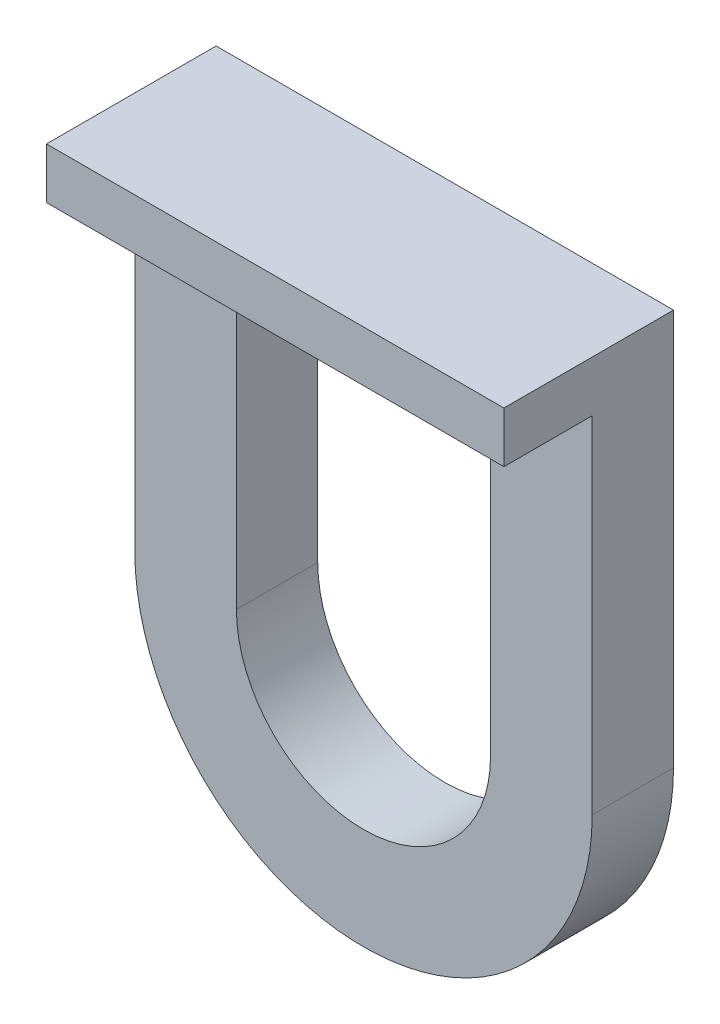
ISO-10303-21;
HEADER;
FILE_DESCRIPTION(('STEP AP214'),'2;1');
FILE_NAME('part.step','',(''),(''),'','','');
FILE_SCHEMA(('AUTOMOTIVE_DESIGN { 1 0 10303 214 1 1 1 1 }'));
ENDSEC;
DATA;
#1=APPLICATION_CONTEXT('core data for automotive mechanical design processes');
#2=APPLICATION_PROTOCOL_DEFINITION('international standard','automotive_design',2000,#1);
#3=PRODUCT_CONTEXT('',#1,'mechanical');
#4=PRODUCT('Part','Part','',(#3));
#5=PRODUCT_RELATED_PRODUCT_CATEGORY('part','',(#4));
#6=PRODUCT_DEFINITION_FORMATION('','',#4);
#7=PRODUCT_DEFINITION_CONTEXT('part definition',#1,'design');
#8=PRODUCT_DEFINITION('design','',#6,#7);
#9=PRODUCT_DEFINITION_SHAPE('','',#8);
#10=(LENGTH_UNIT() NAMED_UNIT(*) SI_UNIT(.MILLI.,.METRE.));
#11=(NAMED_UNIT(*) PLANE_ANGLE_UNIT() SI_UNIT($,.RADIAN.));
#12=(NAMED_UNIT(*) SI_UNIT($,.STERADIAN.) SOLID_ANGLE_UNIT());
#13=UNCERTAINTY_MEASURE_WITH_UNIT(LENGTH_MEASURE(1.E-05),#10,'distance_accuracy_value','');
#14=(GEOMETRIC_REPRESENTATION_CONTEXT(3) GLOBAL_UNCERTAINTY_ASSIGNED_CONTEXT((#13)) GLOBAL_UNIT_ASSIGNED_CONTEXT((#10,
#11,#12)) REPRESENTATION_CONTEXT('',''));
#15=CARTESIAN_POINT('',(0.,0.,0.));
#16=DIRECTION('',(0.,0.,1.));
#17=DIRECTION('',(1.,0.,0.));
#18=AXIS2_PLACEMENT_3D('',#15,#16,#17);
#19=CARTESIAN_POINT('',(-12.5,0.,8.));
#20=DIRECTION('',(-1.,0.,0.));
#21=DIRECTION('',(0.,0.,1.));
#22=AXIS2_PLACEMENT_3D('',#19,#20,#21);
#23=PLANE('',#22);
#24=DIRECTION('',(0.,0.,1.));
#25=VECTOR('',#24,1.);
#26=CARTESIAN_POINT('',(-12.5,34.,-25.4950975679639));
#27=LINE('',#26,#25);
#28=CARTESIAN_POINT('',(-12.5,34.,0.));
#29=VERTEX_POINT('',#28);
#30=CARTESIAN_POINT('',(-12.5,34.,8.));
#31=VERTEX_POINT('',#30);
#32=EDGE_CURVE('E116',#29,#31,#27,.T.);
#33=ORIENTED_EDGE('',*,*,#32,.T.);
#34=DIRECTION('',(0.,1.,0.));
#35=VECTOR('',#34,1.);
#36=CARTESIAN_POINT('',(-12.5,0.,8.));
#37=LINE('',#36,#35);
#38=CARTESIAN_POINT('',(-12.5,0.,8.));
#39=VERTEX_POINT('',#38);
#40=EDGE_CURVE('E122',#39,#31,#37,.T.);
#41=ORIENTED_EDGE('',*,*,#40,.F.);
#42=DIRECTION('',(0.,0.,-1.));
#43=VECTOR('',#42,1.);
#44=CARTESIAN_POINT('',(-12.5,0.,8.));
#45=LINE('',#44,#43);
#46=CARTESIAN_POINT('',(-12.5,0.,0.));
#47=VERTEX_POINT('',#46);
#48=EDGE_CURVE('E11',#39,#47,#45,.T.);
#49=ORIENTED_EDGE('',*,*,#48,.T.);
#50=DIRECTION('',(0.,1.,0.));
#51=VECTOR('',#50,1.);
#52=CARTESIAN_POINT('',(-12.5,0.,0.));
#53=LINE('',#52,#51);
#54=EDGE_CURVE('E47',#47,#29,#53,.T.);
#55=ORIENTED_EDGE('',*,*,#54,.T.);
#56=EDGE_LOOP('',(#33,#41,#49,#55));
#57=FACE_BOUND('',#56,.T.);
#58=ADVANCED_FACE('F33',(#57),#23,.F.);
#59=CARTESIAN_POINT('',(12.5,0.,8.));
#60=DIRECTION('',(1.,0.,0.));
#61=DIRECTION('',(0.,0.,-1.));
#62=AXIS2_PLACEMENT_3D('',#59,#60,#61);
#63=PLANE('',#62);
#64=DIRECTION('',(0.,0.,1.));
#65=VECTOR('',#64,1.);
#66=CARTESIAN_POINT('',(12.5,34.,-25.4950975679639));
#67=LINE('',#66,#65);
#68=CARTESIAN_POINT('',(12.5,34.,0.));
#69=VERTEX_POINT('',#68);
#70=CARTESIAN_POINT('',(12.5,34.,8.));
#71=VERTEX_POINT('',#70);
#72=EDGE_CURVE('E55',#69,#71,#67,.T.);
#73=ORIENTED_EDGE('',*,*,#72,.F.);
#74=DIRECTION('',(0.,-1.,0.));
#75=VECTOR('',#74,1.);
#76=CARTESIAN_POINT('',(12.5,0.,0.));
#77=LINE('',#76,#75);
#78=CARTESIAN_POINT('',(12.5,0.,0.));
#79=VERTEX_POINT('',#78);
#80=EDGE_CURVE('E158',#69,#79,#77,.T.);
#81=ORIENTED_EDGE('',*,*,#80,.T.);
#82=DIRECTION('',(0.,0.,-1.));
#83=VECTOR('',#82,1.);
#84=CARTESIAN_POINT('',(12.5,0.,8.));
#85=LINE('',#84,#83);
#86=CARTESIAN_POINT('',(12.5,0.,8.));
#87=VERTEX_POINT('',#86);
#88=EDGE_CURVE('E169',#87,#79,#85,.T.);
#89=ORIENTED_EDGE('',*,*,#88,.F.);
#90=DIRECTION('',(0.,-1.,0.));
#91=VECTOR('',#90,1.);
#92=CARTESIAN_POINT('',(12.5,0.,8.));
#93=LINE('',#92,#91);
#94=EDGE_CURVE('E167',#71,#87,#93,.T.);
#95=ORIENTED_EDGE('',*,*,#94,.F.);
#96=EDGE_LOOP('',(#73,#81,#89,#95));
#97=FACE_BOUND('',#96,.T.);
#98=ADVANCED_FACE('F210',(#97),#63,.F.);
#99=CARTESIAN_POINT('',(0.,0.,8.));
#100=DIRECTION('',(0.,0.,-1.));
#101=DIRECTION('',(-1.,0.,0.));
#102=AXIS2_PLACEMENT_3D('',#99,#100,#101);
#103=CYLINDRICAL_SURFACE('',#102,12.5);
#104=CARTESIAN_POINT('',(0.,0.,0.));
#105=DIRECTION('',(0.,0.,-1.));
#106=DIRECTION('',(1.,0.,0.));
#107=AXIS2_PLACEMENT_3D('',#104,#105,#106);
#108=CIRCLE('',#107,12.5);
#109=EDGE_CURVE('E157',#79,#47,#108,.T.);
#110=ORIENTED_EDGE('',*,*,#109,.T.);
#111=ORIENTED_EDGE('',*,*,#48,.F.);
#112=CARTESIAN_POINT('',(0.,0.,8.));
#113=DIRECTION('',(0.,0.,-1.));
#114=DIRECTION('',(1.,0.,0.));
#115=AXIS2_PLACEMENT_3D('',#112,#113,#114);
#116=CIRCLE('',#115,12.5);
#117=EDGE_CURVE('E127',#87,#39,#116,.T.);
#118=ORIENTED_EDGE('',*,*,#117,.F.);
#119=ORIENTED_EDGE('',*,*,#88,.T.);
#120=EDGE_LOOP('',(#110,#111,#118,#119));
#121=FACE_BOUND('',#120,.T.);
#122=ADVANCED_FACE('F35',(#121),#103,.F.);
#123=CARTESIAN_POINT('',(-22.5,34.,8.));
#124=DIRECTION('',(1.,0.,0.));
#125=DIRECTION('',(0.,0.,-1.));
#126=AXIS2_PLACEMENT_3D('',#123,#124,#125);
#127=PLANE('',#126);
#128=DIRECTION('',(0.,-1.,0.));
#129=VECTOR('',#128,1.);
#130=CARTESIAN_POINT('',(-22.5,34.,0.));
#131=LINE('',#130,#129);
#132=CARTESIAN_POINT('',(-22.5,39.,0.));
#133=VERTEX_POINT('',#132);
#134=CARTESIAN_POINT('',(-22.5,0.,0.));
#135=VERTEX_POINT('',#134);
#136=EDGE_CURVE('E173',#133,#135,#131,.T.);
#137=ORIENTED_EDGE('',*,*,#136,.T.);
#138=DIRECTION('',(0.,0.,-1.));
#139=VECTOR('',#138,1.);
#140=CARTESIAN_POINT('',(-22.5,0.,8.));
#141=LINE('',#140,#139);
#142=CARTESIAN_POINT('',(-22.5,0.,8.));
#143=VERTEX_POINT('',#142);
#144=EDGE_CURVE('E41',#143,#135,#141,.T.);
#145=ORIENTED_EDGE('',*,*,#144,.F.);
#146=DIRECTION('',(0.,-1.,0.));
#147=VECTOR('',#146,1.);
#148=CARTESIAN_POINT('',(-22.5,34.,8.));
#149=LINE('',#148,#147);
#150=CARTESIAN_POINT('',(-22.5,34.,8.));
#151=VERTEX_POINT('',#150);
#152=EDGE_CURVE('E121',#151,#143,#149,.T.);
#153=ORIENTED_EDGE('',*,*,#152,.F.);
#154=DIRECTION('',(0.,0.,1.));
#155=VECTOR('',#154,1.);
#156=CARTESIAN_POINT('',(-22.5,34.,8.68404238410903));
#157=LINE('',#156,#155);
#158=CARTESIAN_POINT('',(-22.5,34.,16.684042384109));
#159=VERTEX_POINT('',#158);
#160=EDGE_CURVE('E118',#151,#159,#157,.T.);
#161=ORIENTED_EDGE('',*,*,#160,.T.);
#162=DIRECTION('',(0.,-1.,0.));
#163=VECTOR('',#162,1.);
#164=CARTESIAN_POINT('',(-22.5,39.,16.684042384109));
#165=LINE('',#164,#163);
#166=CARTESIAN_POINT('',(-22.5,39.,16.684042384109));
#167=VERTEX_POINT('',#166);
#168=EDGE_CURVE('E154',#167,#159,#165,.T.);
#169=ORIENTED_EDGE('',*,*,#168,.F.);
#170=DIRECTION('',(0.,0.,1.));
#171=VECTOR('',#170,1.);
#172=CARTESIAN_POINT('',(-22.5,39.,0.));
#173=LINE('',#172,#171);
#174=EDGE_CURVE('E138',#133,#167,#173,.T.);
#175=ORIENTED_EDGE('',*,*,#174,.F.);
#176=EDGE_LOOP('',(#137,#145,#153,#161,#169,#175));
#177=FACE_BOUND('',#176,.T.);
#178=ADVANCED_FACE('F228',(#177),#127,.F.);
#179=CARTESIAN_POINT('',(0.,0.,8.));
#180=DIRECTION('',(0.,0.,-1.));
#181=DIRECTION('',(-1.,0.,0.));
#182=AXIS2_PLACEMENT_3D('',#179,#180,#181);
#183=CYLINDRICAL_SURFACE('',#182,22.5);
#184=CARTESIAN_POINT('',(0.,0.,0.));
#185=DIRECTION('',(0.,0.,1.));
#186=DIRECTION('',(1.,0.,0.));
#187=AXIS2_PLACEMENT_3D('',#184,#185,#186);
#188=CIRCLE('',#187,22.5);
#189=CARTESIAN_POINT('',(22.5,0.,0.));
#190=VERTEX_POINT('',#189);
#191=EDGE_CURVE('E175',#135,#190,#188,.T.);
#192=ORIENTED_EDGE('',*,*,#191,.T.);
#193=DIRECTION('',(0.,0.,-1.));
#194=VECTOR('',#193,1.);
#195=CARTESIAN_POINT('',(22.5,0.,8.));
#196=LINE('',#195,#194);
#197=CARTESIAN_POINT('',(22.5,0.,8.));
#198=VERTEX_POINT('',#197);
#199=EDGE_CURVE('E183',#198,#190,#196,.T.);
#200=ORIENTED_EDGE('',*,*,#199,.F.);
#201=CARTESIAN_POINT('',(0.,0.,8.));
#202=DIRECTION('',(0.,0.,1.));
#203=DIRECTION('',(1.,0.,0.));
#204=AXIS2_PLACEMENT_3D('',#201,#202,#203);
#205=CIRCLE('',#204,22.5);
#206=EDGE_CURVE('E161',#143,#198,#205,.T.);
#207=ORIENTED_EDGE('',*,*,#206,.F.);
#208=ORIENTED_EDGE('',*,*,#144,.T.);
#209=EDGE_LOOP('',(#192,#200,#207,#208));
#210=FACE_BOUND('',#209,.T.);
#211=ADVANCED_FACE('F190',(#210),#183,.T.);
#212=CARTESIAN_POINT('',(22.5,34.,8.));
#213=DIRECTION('',(-1.,0.,0.));
#214=DIRECTION('',(0.,0.,1.));
#215=AXIS2_PLACEMENT_3D('',#212,#213,#214);
#216=PLANE('',#215);
#217=DIRECTION('',(0.,1.,0.));
#218=VECTOR('',#217,1.);
#219=CARTESIAN_POINT('',(22.5,34.,0.));
#220=LINE('',#219,#218);
#221=CARTESIAN_POINT('',(22.5,39.,0.));
#222=VERTEX_POINT('',#221);
#223=EDGE_CURVE('E177',#190,#222,#220,.T.);
#224=ORIENTED_EDGE('',*,*,#223,.T.);
#225=DIRECTION('',(0.,0.,-1.));
#226=VECTOR('',#225,1.);
#227=CARTESIAN_POINT('',(22.5,39.,16.684042384109));
#228=LINE('',#227,#226);
#229=CARTESIAN_POINT('',(22.5,39.,16.684042384109));
#230=VERTEX_POINT('',#229);
#231=EDGE_CURVE('E143',#230,#222,#228,.T.);
#232=ORIENTED_EDGE('',*,*,#231,.F.);
#233=DIRECTION('',(0.,-1.,0.));
#234=VECTOR('',#233,1.);
#235=CARTESIAN_POINT('',(22.5,39.,16.684042384109));
#236=LINE('',#235,#234);
#237=CARTESIAN_POINT('',(22.5,34.,16.684042384109));
#238=VERTEX_POINT('',#237);
#239=EDGE_CURVE('E146',#230,#238,#236,.T.);
#240=ORIENTED_EDGE('',*,*,#239,.T.);
#241=DIRECTION('',(0.,0.,-1.));
#242=VECTOR('',#241,1.);
#243=CARTESIAN_POINT('',(22.5,34.,16.684042384109));
#244=LINE('',#243,#242);
#245=CARTESIAN_POINT('',(22.5,34.,8.));
#246=VERTEX_POINT('',#245);
#247=EDGE_CURVE('E139',#238,#246,#244,.T.);
#248=ORIENTED_EDGE('',*,*,#247,.T.);
#249=DIRECTION('',(0.,1.,0.));
#250=VECTOR('',#249,1.);
#251=CARTESIAN_POINT('',(22.5,34.,8.));
#252=LINE('',#251,#250);
#253=EDGE_CURVE('E163',#198,#246,#252,.T.);
#254=ORIENTED_EDGE('',*,*,#253,.F.);
#255=ORIENTED_EDGE('',*,*,#199,.T.);
#256=EDGE_LOOP('',(#224,#232,#240,#248,#254,#255));
#257=FACE_BOUND('',#256,.T.);
#258=ADVANCED_FACE('F199',(#257),#216,.F.);
#259=CARTESIAN_POINT('',(0.,0.,8.));
#260=DIRECTION('',(0.,0.,1.));
#261=DIRECTION('',(1.,0.,0.));
#262=AXIS2_PLACEMENT_3D('',#259,#260,#261);
#263=PLANE('',#262);
#264=ORIENTED_EDGE('',*,*,#117,.T.);
#265=ORIENTED_EDGE('',*,*,#40,.T.);
#266=DIRECTION('',(-1.,0.,0.));
#267=VECTOR('',#266,1.);
#268=CARTESIAN_POINT('',(-12.5,34.,8.));
#269=LINE('',#268,#267);
#270=EDGE_CURVE('E111',#31,#151,#269,.T.);
#271=ORIENTED_EDGE('',*,*,#270,.T.);
#272=ORIENTED_EDGE('',*,*,#152,.T.);
#273=ORIENTED_EDGE('',*,*,#206,.T.);
#274=ORIENTED_EDGE('',*,*,#253,.T.);
#275=DIRECTION('',(-1.,0.,0.));
#276=VECTOR('',#275,1.);
#277=CARTESIAN_POINT('',(12.5,34.,8.));
#278=LINE('',#277,#276);
#279=EDGE_CURVE('E165',#246,#71,#278,.T.);
#280=ORIENTED_EDGE('',*,*,#279,.T.);
#281=ORIENTED_EDGE('',*,*,#94,.T.);
#282=EDGE_LOOP('',(#264,#265,#271,#272,#273,#274,#280,#281));
#283=FACE_BOUND('',#282,.T.);
#284=ADVANCED_FACE('F125',(#283),#263,.T.);
#285=CARTESIAN_POINT('',(0.,0.,0.));
#286=DIRECTION('',(0.,0.,1.));
#287=DIRECTION('',(1.,0.,0.));
#288=AXIS2_PLACEMENT_3D('',#285,#286,#287);
#289=PLANE('',#288);
#290=DIRECTION('',(1.,0.,0.));
#291=VECTOR('',#290,1.);
#292=CARTESIAN_POINT('',(12.5,34.,0.));
#293=LINE('',#292,#291);
#294=EDGE_CURVE('E131',#29,#69,#293,.T.);
#295=ORIENTED_EDGE('',*,*,#294,.F.);
#296=ORIENTED_EDGE('',*,*,#54,.F.);
#297=ORIENTED_EDGE('',*,*,#109,.F.);
#298=ORIENTED_EDGE('',*,*,#80,.F.);
#299=EDGE_LOOP('',(#295,#296,#297,#298));
#300=FACE_BOUND('',#299,.T.);
#301=DIRECTION('',(-1.,0.,0.));
#302=VECTOR('',#301,1.);
#303=CARTESIAN_POINT('',(-12.5,39.,0.));
#304=LINE('',#303,#302);
#305=EDGE_CURVE('E135',#222,#133,#304,.T.);
#306=ORIENTED_EDGE('',*,*,#305,.F.);
#307=ORIENTED_EDGE('',*,*,#223,.F.);
#308=ORIENTED_EDGE('',*,*,#191,.F.);
#309=ORIENTED_EDGE('',*,*,#136,.F.);
#310=EDGE_LOOP('',(#306,#307,#308,#309));
#311=FACE_BOUND('',#310,.T.);
#312=ADVANCED_FACE('F195',(#300,#311),#289,.F.);
#313=CARTESIAN_POINT('',(-22.5,39.,16.684042384109));
#314=DIRECTION('',(0.,0.,-1.));
#315=DIRECTION('',(-1.,0.,0.));
#316=AXIS2_PLACEMENT_3D('',#313,#314,#315);
#317=PLANE('',#316);
#318=DIRECTION('',(1.,0.,0.));
#319=VECTOR('',#318,1.);
#320=CARTESIAN_POINT('',(-22.5,34.,16.684042384109));
#321=LINE('',#320,#319);
#322=EDGE_CURVE('E148',#159,#238,#321,.T.);
#323=ORIENTED_EDGE('',*,*,#322,.T.);
#324=ORIENTED_EDGE('',*,*,#239,.F.);
#325=DIRECTION('',(1.,0.,0.));
#326=VECTOR('',#325,1.);
#327=CARTESIAN_POINT('',(-22.5,39.,16.684042384109));
#328=LINE('',#327,#326);
#329=EDGE_CURVE('E141',#167,#230,#328,.T.);
#330=ORIENTED_EDGE('',*,*,#329,.F.);
#331=ORIENTED_EDGE('',*,*,#168,.T.);
#332=EDGE_LOOP('',(#323,#324,#330,#331));
#333=FACE_BOUND('',#332,.T.);
#334=ADVANCED_FACE('F207',(#333),#317,.F.);
#335=CARTESIAN_POINT('',(0.,39.,0.));
#336=DIRECTION('',(0.,1.,0.));
#337=DIRECTION('',(0.,0.,1.));
#338=AXIS2_PLACEMENT_3D('',#335,#336,#337);
#339=PLANE('',#338);
#340=ORIENTED_EDGE('',*,*,#231,.T.);
#341=ORIENTED_EDGE('',*,*,#305,.T.);
#342=ORIENTED_EDGE('',*,*,#174,.T.);
#343=ORIENTED_EDGE('',*,*,#329,.T.);
#344=EDGE_LOOP('',(#340,#341,#342,#343));
#345=FACE_BOUND('',#344,.T.);
#346=ADVANCED_FACE('F202',(#345),#339,.T.);
#347=CARTESIAN_POINT('',(0.,34.,0.));
#348=DIRECTION('',(0.,1.,0.));
#349=DIRECTION('',(0.,0.,1.));
#350=AXIS2_PLACEMENT_3D('',#347,#348,#349);
#351=PLANE('',#350);
#352=ORIENTED_EDGE('',*,*,#279,.F.);
#353=ORIENTED_EDGE('',*,*,#247,.F.);
#354=ORIENTED_EDGE('',*,*,#322,.F.);
#355=ORIENTED_EDGE('',*,*,#160,.F.);
#356=ORIENTED_EDGE('',*,*,#270,.F.);
#357=ORIENTED_EDGE('',*,*,#32,.F.);
#358=ORIENTED_EDGE('',*,*,#294,.T.);
#359=ORIENTED_EDGE('',*,*,#72,.T.);
#360=EDGE_LOOP('',(#352,#353,#354,#355,#356,#357,#358,#359));
#361=FACE_BOUND('',#360,.T.);
#362=ADVANCED_FACE('F114',(#361),#351,.F.);
#363=CLOSED_SHELL('',(#58,#98,#122,#178,#211,#258,#284,#312,#334,#346,#362));
#364=MANIFOLD_SOLID_BREP('B2',#363);
#365=ADVANCED_BREP_SHAPE_REPRESENTATION('',(#18,#364),#14);
#366=SHAPE_DEFINITION_REPRESENTATION(#9,#365);
ENDSEC;
END-ISO-10303-21;
